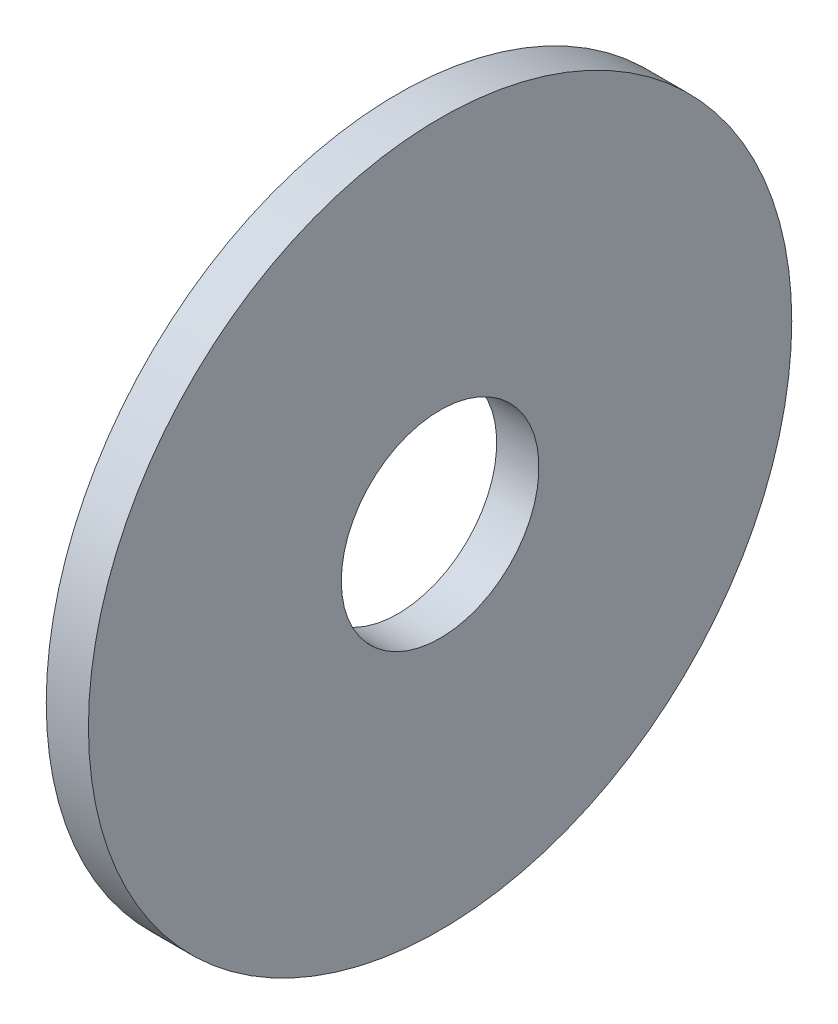
ISO-10303-21;
HEADER;
FILE_DESCRIPTION(('STEP AP214'),'2;1');
FILE_NAME('part.step','',(''),(''),'','','');
FILE_SCHEMA(('AUTOMOTIVE_DESIGN { 1 0 10303 214 1 1 1 1 }'));
ENDSEC;
DATA;
#1=APPLICATION_CONTEXT('core data for automotive mechanical design processes');
#2=APPLICATION_PROTOCOL_DEFINITION('international standard','automotive_design',2000,#1);
#3=PRODUCT_CONTEXT('',#1,'mechanical');
#4=PRODUCT('Part','Part','',(#3));
#5=PRODUCT_RELATED_PRODUCT_CATEGORY('part','',(#4));
#6=PRODUCT_DEFINITION_FORMATION('','',#4);
#7=PRODUCT_DEFINITION_CONTEXT('part definition',#1,'design');
#8=PRODUCT_DEFINITION('design','',#6,#7);
#9=PRODUCT_DEFINITION_SHAPE('','',#8);
#10=(LENGTH_UNIT() NAMED_UNIT(*) SI_UNIT(.MILLI.,.METRE.));
#11=(NAMED_UNIT(*) PLANE_ANGLE_UNIT() SI_UNIT($,.RADIAN.));
#12=(NAMED_UNIT(*) SI_UNIT($,.STERADIAN.) SOLID_ANGLE_UNIT());
#13=UNCERTAINTY_MEASURE_WITH_UNIT(LENGTH_MEASURE(1.E-05),#10,'distance_accuracy_value','');
#14=(GEOMETRIC_REPRESENTATION_CONTEXT(3) GLOBAL_UNCERTAINTY_ASSIGNED_CONTEXT((#13)) GLOBAL_UNIT_ASSIGNED_CONTEXT((#10,
#11,#12)) REPRESENTATION_CONTEXT('',''));
#15=CARTESIAN_POINT('',(0.,0.,0.));
#16=DIRECTION('',(0.,0.,1.));
#17=DIRECTION('',(1.,0.,0.));
#18=AXIS2_PLACEMENT_3D('',#15,#16,#17);
#19=CARTESIAN_POINT('',(1.524,0.,0.));
#20=DIRECTION('',(1.,0.,0.));
#21=DIRECTION('',(0.,0.,-1.));
#22=AXIS2_PLACEMENT_3D('',#19,#20,#21);
#23=PLANE('',#22);
#24=CARTESIAN_POINT('',(1.524,0.,0.));
#25=DIRECTION('',(1.,0.,0.));
#26=DIRECTION('',(0.,0.,-1.));
#27=AXIS2_PLACEMENT_3D('',#24,#25,#26);
#28=CIRCLE('',#27,12.7);
#29=CARTESIAN_POINT('',(1.524,0.,12.7));
#30=VERTEX_POINT('',#29);
#31=EDGE_CURVE('E10',#30,#30,#28,.T.);
#32=ORIENTED_EDGE('',*,*,#31,.T.);
#33=EDGE_LOOP('',(#32));
#34=FACE_BOUND('',#33,.T.);
#35=CARTESIAN_POINT('',(1.524,0.,0.));
#36=DIRECTION('',(1.,0.,0.));
#37=DIRECTION('',(0.,0.,-1.));
#38=AXIS2_PLACEMENT_3D('',#35,#36,#37);
#39=CIRCLE('',#38,3.5687);
#40=CARTESIAN_POINT('',(1.524,0.,3.5687));
#41=VERTEX_POINT('',#40);
#42=EDGE_CURVE('E46',#41,#41,#39,.T.);
#43=ORIENTED_EDGE('',*,*,#42,.F.);
#44=EDGE_LOOP('',(#43));
#45=FACE_BOUND('',#44,.T.);
#46=ADVANCED_FACE('F32',(#34,#45),#23,.T.);
#47=CARTESIAN_POINT('',(0.,0.,0.));
#48=DIRECTION('',(1.,0.,0.));
#49=DIRECTION('',(0.,0.,-1.));
#50=AXIS2_PLACEMENT_3D('',#47,#48,#49);
#51=PLANE('',#50);
#52=CARTESIAN_POINT('',(0.,0.,0.));
#53=DIRECTION('',(1.,0.,0.));
#54=DIRECTION('',(0.,0.,-1.));
#55=AXIS2_PLACEMENT_3D('',#52,#53,#54);
#56=CIRCLE('',#55,12.7);
#57=CARTESIAN_POINT('',(0.,0.,12.7));
#58=VERTEX_POINT('',#57);
#59=EDGE_CURVE('E36',#58,#58,#56,.T.);
#60=ORIENTED_EDGE('',*,*,#59,.F.);
#61=EDGE_LOOP('',(#60));
#62=FACE_BOUND('',#61,.T.);
#63=CARTESIAN_POINT('',(0.,0.,0.));
#64=DIRECTION('',(1.,0.,0.));
#65=DIRECTION('',(0.,0.,-1.));
#66=AXIS2_PLACEMENT_3D('',#63,#64,#65);
#67=CIRCLE('',#66,3.5687);
#68=CARTESIAN_POINT('',(0.,0.,3.5687));
#69=VERTEX_POINT('',#68);
#70=EDGE_CURVE('E48',#69,#69,#67,.T.);
#71=ORIENTED_EDGE('',*,*,#70,.T.);
#72=EDGE_LOOP('',(#71));
#73=FACE_BOUND('',#72,.T.);
#74=ADVANCED_FACE('F62',(#62,#73),#51,.F.);
#75=CARTESIAN_POINT('',(1.524,0.,0.));
#76=DIRECTION('',(-1.,0.,0.));
#77=DIRECTION('',(0.,0.,1.));
#78=AXIS2_PLACEMENT_3D('',#75,#76,#77);
#79=CYLINDRICAL_SURFACE('',#78,12.7);
#80=CARTESIAN_POINT('',(1.524,0.,12.7));
#81=CARTESIAN_POINT('',(1.508125,0.,12.7));
#82=CARTESIAN_POINT('',(1.49225,0.,12.7));
#83=CARTESIAN_POINT('',(1.4605,0.,12.7));
#84=CARTESIAN_POINT('',(1.444625,0.,12.7));
#85=CARTESIAN_POINT('',(1.412875,0.,12.7));
#86=CARTESIAN_POINT('',(1.397,0.,12.7));
#87=CARTESIAN_POINT('',(1.36525,0.,12.7));
#88=CARTESIAN_POINT('',(1.349375,0.,12.7));
#89=CARTESIAN_POINT('',(1.317625,0.,12.7));
#90=CARTESIAN_POINT('',(1.30175,0.,12.7));
#91=CARTESIAN_POINT('',(1.27,0.,12.7));
#92=CARTESIAN_POINT('',(1.254125,0.,12.7));
#93=CARTESIAN_POINT('',(1.222375,0.,12.7));
#94=CARTESIAN_POINT('',(1.2065,0.,12.7));
#95=CARTESIAN_POINT('',(1.17475,0.,12.7));
#96=CARTESIAN_POINT('',(1.158875,0.,12.7));
#97=CARTESIAN_POINT('',(1.127125,0.,12.7));
#98=CARTESIAN_POINT('',(1.11125,0.,12.7));
#99=CARTESIAN_POINT('',(1.0795,0.,12.7));
#100=CARTESIAN_POINT('',(1.063625,0.,12.7));
#101=CARTESIAN_POINT('',(1.031875,0.,12.7));
#102=CARTESIAN_POINT('',(1.016,0.,12.7));
#103=CARTESIAN_POINT('',(0.98425,0.,12.7));
#104=CARTESIAN_POINT('',(0.968375,0.,12.7));
#105=CARTESIAN_POINT('',(0.936625,0.,12.7));
#106=CARTESIAN_POINT('',(0.92075,0.,12.7));
#107=CARTESIAN_POINT('',(0.889,0.,12.7));
#108=CARTESIAN_POINT('',(0.873125,0.,12.7));
#109=CARTESIAN_POINT('',(0.841375,0.,12.7));
#110=CARTESIAN_POINT('',(0.8255,0.,12.7));
#111=CARTESIAN_POINT('',(0.79375,0.,12.7));
#112=CARTESIAN_POINT('',(0.777875,0.,12.7));
#113=CARTESIAN_POINT('',(0.746125,0.,12.7));
#114=CARTESIAN_POINT('',(0.73025,0.,12.7));
#115=CARTESIAN_POINT('',(0.6985,0.,12.7));
#116=CARTESIAN_POINT('',(0.682625,0.,12.7));
#117=CARTESIAN_POINT('',(0.650875,0.,12.7));
#118=CARTESIAN_POINT('',(0.635,0.,12.7));
#119=CARTESIAN_POINT('',(0.60325,0.,12.7));
#120=CARTESIAN_POINT('',(0.587375,0.,12.7));
#121=CARTESIAN_POINT('',(0.555625,0.,12.7));
#122=CARTESIAN_POINT('',(0.53975,0.,12.7));
#123=CARTESIAN_POINT('',(0.508,0.,12.7));
#124=CARTESIAN_POINT('',(0.492125,0.,12.7));
#125=CARTESIAN_POINT('',(0.460375,0.,12.7));
#126=CARTESIAN_POINT('',(0.4445,0.,12.7));
#127=CARTESIAN_POINT('',(0.41275,0.,12.7));
#128=CARTESIAN_POINT('',(0.396875,0.,12.7));
#129=CARTESIAN_POINT('',(0.365125,0.,12.7));
#130=CARTESIAN_POINT('',(0.34925,0.,12.7));
#131=CARTESIAN_POINT('',(0.3175,0.,12.7));
#132=CARTESIAN_POINT('',(0.301625,0.,12.7));
#133=CARTESIAN_POINT('',(0.269875,0.,12.7));
#134=CARTESIAN_POINT('',(0.254,0.,12.7));
#135=CARTESIAN_POINT('',(0.22225,0.,12.7));
#136=CARTESIAN_POINT('',(0.206375,0.,12.7));
#137=CARTESIAN_POINT('',(0.174625,0.,12.7));
#138=CARTESIAN_POINT('',(0.15875,0.,12.7));
#139=CARTESIAN_POINT('',(0.127,0.,12.7));
#140=CARTESIAN_POINT('',(0.111125,0.,12.7));
#141=CARTESIAN_POINT('',(0.079375,0.,12.7));
#142=CARTESIAN_POINT('',(0.0635,0.,12.7));
#143=CARTESIAN_POINT('',(0.0317499999999999,0.,12.7));
#144=CARTESIAN_POINT('',(0.015875,0.,12.7));
#145=CARTESIAN_POINT('',(0.,0.,12.7));
#146=B_SPLINE_CURVE_WITH_KNOTS('',3,(#80,#81,#82,#83,#84,#85,#86,#87,#88,#89,#90,#91,#92,#93,
#94,#95,#96,#97,#98,#99,#100,#101,#102,#103,#104,#105,#106,#107,#108,#109,#110,#111,#112,#113,
#114,#115,#116,#117,#118,#119,#120,#121,#122,#123,#124,#125,#126,#127,#128,#129,#130,#131,#132,
#133,#134,#135,#136,#137,#138,#139,#140,#141,#142,#143,#144,#145),.UNSPECIFIED.,.F.,.F.,(4,2,2,
2,2,2,2,2,2,2,2,2,2,2,2,2,2,2,2,2,2,2,2,2,2,2,2,2,2,2,2,2,4),(0.,0.0476250000000001,
0.0952500000000001,0.142875,0.1905,0.238125,0.28575,0.333375,0.381,0.428625,0.47625,0.523875,
0.5715,0.619125,0.66675,0.714375,0.762,0.809625,0.85725,0.904875,0.9525,1.000125,1.04775,
1.095375,1.143,1.190625,1.23825,1.285875,1.3335,1.381125,1.42875,1.476375,1.524),.UNSPECIFIED.);
#147=EDGE_CURVE('BSEAM34',#30,#58,#146,.T.);
#148=ORIENTED_EDGE('',*,*,#31,.F.);
#149=ORIENTED_EDGE('',*,*,#59,.T.);
#150=ORIENTED_EDGE('',*,*,#147,.T.);
#151=ORIENTED_EDGE('',*,*,#147,.F.);
#152=EDGE_LOOP('',(#148,#150,#149,#151));
#153=FACE_BOUND('',#152,.T.);
#154=ADVANCED_FACE('F34',(#153),#79,.T.);
#155=CARTESIAN_POINT('',(1.524,0.,0.));
#156=DIRECTION('',(-1.,0.,0.));
#157=DIRECTION('',(0.,0.,1.));
#158=AXIS2_PLACEMENT_3D('',#155,#156,#157);
#159=CYLINDRICAL_SURFACE('',#158,3.5687);
#160=CARTESIAN_POINT('',(1.524,0.,3.5687));
#161=CARTESIAN_POINT('',(1.508125,0.,3.5687));
#162=CARTESIAN_POINT('',(1.49225,0.,3.5687));
#163=CARTESIAN_POINT('',(1.4605,0.,3.5687));
#164=CARTESIAN_POINT('',(1.444625,0.,3.5687));
#165=CARTESIAN_POINT('',(1.412875,0.,3.5687));
#166=CARTESIAN_POINT('',(1.397,0.,3.5687));
#167=CARTESIAN_POINT('',(1.36525,0.,3.5687));
#168=CARTESIAN_POINT('',(1.349375,0.,3.5687));
#169=CARTESIAN_POINT('',(1.317625,0.,3.5687));
#170=CARTESIAN_POINT('',(1.30175,0.,3.5687));
#171=CARTESIAN_POINT('',(1.27,0.,3.5687));
#172=CARTESIAN_POINT('',(1.254125,0.,3.5687));
#173=CARTESIAN_POINT('',(1.222375,0.,3.5687));
#174=CARTESIAN_POINT('',(1.2065,0.,3.5687));
#175=CARTESIAN_POINT('',(1.17475,0.,3.5687));
#176=CARTESIAN_POINT('',(1.158875,0.,3.5687));
#177=CARTESIAN_POINT('',(1.127125,0.,3.5687));
#178=CARTESIAN_POINT('',(1.11125,0.,3.5687));
#179=CARTESIAN_POINT('',(1.0795,0.,3.5687));
#180=CARTESIAN_POINT('',(1.063625,0.,3.5687));
#181=CARTESIAN_POINT('',(1.031875,0.,3.5687));
#182=CARTESIAN_POINT('',(1.016,0.,3.5687));
#183=CARTESIAN_POINT('',(0.98425,0.,3.5687));
#184=CARTESIAN_POINT('',(0.968375,0.,3.5687));
#185=CARTESIAN_POINT('',(0.936625,0.,3.5687));
#186=CARTESIAN_POINT('',(0.92075,0.,3.5687));
#187=CARTESIAN_POINT('',(0.889,0.,3.5687));
#188=CARTESIAN_POINT('',(0.873125,0.,3.5687));
#189=CARTESIAN_POINT('',(0.841375,0.,3.5687));
#190=CARTESIAN_POINT('',(0.8255,0.,3.5687));
#191=CARTESIAN_POINT('',(0.79375,0.,3.5687));
#192=CARTESIAN_POINT('',(0.777875,0.,3.5687));
#193=CARTESIAN_POINT('',(0.746125,0.,3.5687));
#194=CARTESIAN_POINT('',(0.73025,0.,3.5687));
#195=CARTESIAN_POINT('',(0.6985,0.,3.5687));
#196=CARTESIAN_POINT('',(0.682625,0.,3.5687));
#197=CARTESIAN_POINT('',(0.650875,0.,3.5687));
#198=CARTESIAN_POINT('',(0.635,0.,3.5687));
#199=CARTESIAN_POINT('',(0.60325,0.,3.5687));
#200=CARTESIAN_POINT('',(0.587375,0.,3.5687));
#201=CARTESIAN_POINT('',(0.555625,0.,3.5687));
#202=CARTESIAN_POINT('',(0.53975,0.,3.5687));
#203=CARTESIAN_POINT('',(0.508,0.,3.5687));
#204=CARTESIAN_POINT('',(0.492125,0.,3.5687));
#205=CARTESIAN_POINT('',(0.460375,0.,3.5687));
#206=CARTESIAN_POINT('',(0.4445,0.,3.5687));
#207=CARTESIAN_POINT('',(0.41275,0.,3.5687));
#208=CARTESIAN_POINT('',(0.396875,0.,3.5687));
#209=CARTESIAN_POINT('',(0.365125,0.,3.5687));
#210=CARTESIAN_POINT('',(0.34925,0.,3.5687));
#211=CARTESIAN_POINT('',(0.3175,0.,3.5687));
#212=CARTESIAN_POINT('',(0.301625,0.,3.5687));
#213=CARTESIAN_POINT('',(0.269875,0.,3.5687));
#214=CARTESIAN_POINT('',(0.254,0.,3.5687));
#215=CARTESIAN_POINT('',(0.22225,0.,3.5687));
#216=CARTESIAN_POINT('',(0.206375,0.,3.5687));
#217=CARTESIAN_POINT('',(0.174625,0.,3.5687));
#218=CARTESIAN_POINT('',(0.15875,0.,3.5687));
#219=CARTESIAN_POINT('',(0.127,0.,3.5687));
#220=CARTESIAN_POINT('',(0.111125,0.,3.5687));
#221=CARTESIAN_POINT('',(0.079375,0.,3.5687));
#222=CARTESIAN_POINT('',(0.0635,0.,3.5687));
#223=CARTESIAN_POINT('',(0.0317499999999999,0.,3.5687));
#224=CARTESIAN_POINT('',(0.015875,0.,3.5687));
#225=CARTESIAN_POINT('',(0.,0.,3.5687));
#226=B_SPLINE_CURVE_WITH_KNOTS('',3,(#160,#161,#162,#163,#164,#165,#166,#167,#168,#169,#170,
#171,#172,#173,#174,#175,#176,#177,#178,#179,#180,#181,#182,#183,#184,#185,#186,#187,#188,#189,
#190,#191,#192,#193,#194,#195,#196,#197,#198,#199,#200,#201,#202,#203,#204,#205,#206,#207,#208,
#209,#210,#211,#212,#213,#214,#215,#216,#217,#218,#219,#220,#221,#222,#223,#224,#225),
.UNSPECIFIED.,.F.,.F.,(4,2,2,2,2,2,2,2,2,2,2,2,2,2,2,2,2,2,2,2,2,2,2,2,2,2,2,2,2,2,2,2,4),(0.,
0.0476249999999999,0.0952499999999998,0.142875,0.1905,0.238125,0.28575,0.333375,0.381,0.428625,
0.47625,0.523875,0.5715,0.619125,0.66675,0.714375,0.762,0.809625,0.85725,0.904875,0.9525,
1.000125,1.04775,1.095375,1.143,1.190625,1.23825,1.285875,1.3335,1.381125,1.42875,1.476375,
1.524),.UNSPECIFIED.);
#227=EDGE_CURVE('BSEAM58',#41,#69,#226,.T.);
#228=ORIENTED_EDGE('',*,*,#42,.T.);
#229=ORIENTED_EDGE('',*,*,#70,.F.);
#230=ORIENTED_EDGE('',*,*,#227,.T.);
#231=ORIENTED_EDGE('',*,*,#227,.F.);
#232=EDGE_LOOP('',(#228,#230,#229,#231));
#233=FACE_BOUND('',#232,.T.);
#234=ADVANCED_FACE('F58',(#233),#159,.F.);
#235=CLOSED_SHELL('',(#46,#74,#154,#234));
#236=MANIFOLD_SOLID_BREP('B2',#235);
#237=ADVANCED_BREP_SHAPE_REPRESENTATION('',(#18,#236),#14);
#238=SHAPE_DEFINITION_REPRESENTATION(#9,#237);
ENDSEC;
END-ISO-10303-21;
